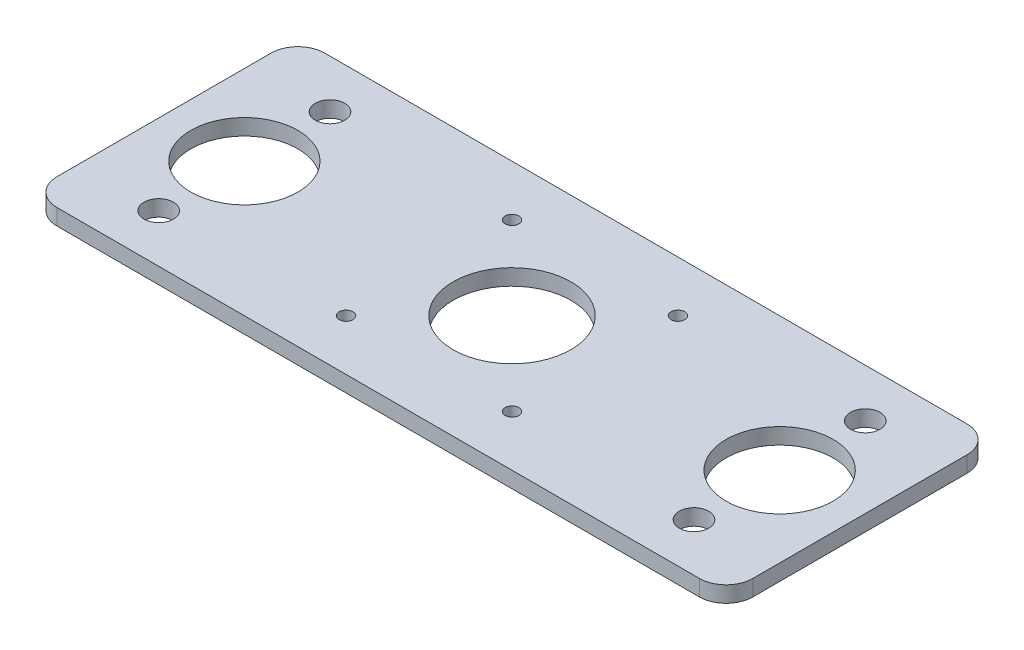
ISO-10303-21;
HEADER;
FILE_DESCRIPTION(('STEP AP214'),'2;1');
FILE_NAME('part.step','',(''),(''),'','','');
FILE_SCHEMA(('AUTOMOTIVE_DESIGN { 1 0 10303 214 1 1 1 1 }'));
ENDSEC;
DATA;
#1=APPLICATION_CONTEXT('core data for automotive mechanical design processes');
#2=APPLICATION_PROTOCOL_DEFINITION('international standard','automotive_design',2000,#1);
#3=PRODUCT_CONTEXT('',#1,'mechanical');
#4=PRODUCT('Part','Part','',(#3));
#5=PRODUCT_RELATED_PRODUCT_CATEGORY('part','',(#4));
#6=PRODUCT_DEFINITION_FORMATION('','',#4);
#7=PRODUCT_DEFINITION_CONTEXT('part definition',#1,'design');
#8=PRODUCT_DEFINITION('design','',#6,#7);
#9=PRODUCT_DEFINITION_SHAPE('','',#8);
#10=(LENGTH_UNIT() NAMED_UNIT(*) SI_UNIT(.MILLI.,.METRE.));
#11=(NAMED_UNIT(*) PLANE_ANGLE_UNIT() SI_UNIT($,.RADIAN.));
#12=(NAMED_UNIT(*) SI_UNIT($,.STERADIAN.) SOLID_ANGLE_UNIT());
#13=UNCERTAINTY_MEASURE_WITH_UNIT(LENGTH_MEASURE(1.E-05),#10,'distance_accuracy_value','');
#14=(GEOMETRIC_REPRESENTATION_CONTEXT(3) GLOBAL_UNCERTAINTY_ASSIGNED_CONTEXT((#13)) GLOBAL_UNIT_ASSIGNED_CONTEXT((#10,
#11,#12)) REPRESENTATION_CONTEXT('',''));
#15=CARTESIAN_POINT('',(0.,0.,0.));
#16=DIRECTION('',(0.,0.,1.));
#17=DIRECTION('',(1.,0.,0.));
#18=AXIS2_PLACEMENT_3D('',#15,#16,#17);
#19=CARTESIAN_POINT('',(-60.,3.,-20.));
#20=DIRECTION('',(0.,-1.,0.));
#21=DIRECTION('',(0.,0.,-1.));
#22=AXIS2_PLACEMENT_3D('',#19,#20,#21);
#23=CYLINDRICAL_SURFACE('',#22,5.);
#24=CARTESIAN_POINT('',(-60.,0.,-20.));
#25=DIRECTION('',(0.,1.,0.));
#26=DIRECTION('',(0.,0.,1.));
#27=AXIS2_PLACEMENT_3D('',#24,#25,#26);
#28=CIRCLE('',#27,5.);
#29=CARTESIAN_POINT('',(-65.,0.,-20.));
#30=VERTEX_POINT('',#29);
#31=CARTESIAN_POINT('',(-60.,0.,-25.));
#32=VERTEX_POINT('',#31);
#33=EDGE_CURVE('E169',#30,#32,#28,.F.);
#34=ORIENTED_EDGE('',*,*,#33,.F.);
#35=DIRECTION('',(0.,-1.,0.));
#36=VECTOR('',#35,1.);
#37=CARTESIAN_POINT('',(-65.,3.,-20.));
#38=LINE('',#37,#36);
#39=CARTESIAN_POINT('',(-65.,3.,-20.));
#40=VERTEX_POINT('',#39);
#41=EDGE_CURVE('E11',#40,#30,#38,.T.);
#42=ORIENTED_EDGE('',*,*,#41,.F.);
#43=CARTESIAN_POINT('',(-60.,3.,-20.));
#44=DIRECTION('',(0.,1.,0.));
#45=DIRECTION('',(0.,0.,1.));
#46=AXIS2_PLACEMENT_3D('',#43,#44,#45);
#47=CIRCLE('',#46,5.);
#48=CARTESIAN_POINT('',(-60.,3.,-25.));
#49=VERTEX_POINT('',#48);
#50=EDGE_CURVE('E222',#40,#49,#47,.F.);
#51=ORIENTED_EDGE('',*,*,#50,.T.);
#52=DIRECTION('',(0.,-1.,0.));
#53=VECTOR('',#52,1.);
#54=CARTESIAN_POINT('',(-60.,3.,-25.));
#55=LINE('',#54,#53);
#56=EDGE_CURVE('E56',#49,#32,#55,.T.);
#57=ORIENTED_EDGE('',*,*,#56,.T.);
#58=EDGE_LOOP('',(#34,#42,#51,#57));
#59=FACE_BOUND('',#58,.T.);
#60=ADVANCED_FACE('F40',(#59),#23,.T.);
#61=CARTESIAN_POINT('',(-65.,3.,0.));
#62=DIRECTION('',(-1.,0.,0.));
#63=DIRECTION('',(0.,0.,1.));
#64=AXIS2_PLACEMENT_3D('',#61,#62,#63);
#65=PLANE('',#64);
#66=DIRECTION('',(0.,0.,-1.));
#67=VECTOR('',#66,1.);
#68=CARTESIAN_POINT('',(-65.,0.,0.));
#69=LINE('',#68,#67);
#70=CARTESIAN_POINT('',(-65.,0.,20.));
#71=VERTEX_POINT('',#70);
#72=EDGE_CURVE('E171',#71,#30,#69,.T.);
#73=ORIENTED_EDGE('',*,*,#72,.F.);
#74=DIRECTION('',(0.,-1.,0.));
#75=VECTOR('',#74,1.);
#76=CARTESIAN_POINT('',(-65.,3.,20.));
#77=LINE('',#76,#75);
#78=CARTESIAN_POINT('',(-65.,3.,20.));
#79=VERTEX_POINT('',#78);
#80=EDGE_CURVE('E48',#79,#71,#77,.T.);
#81=ORIENTED_EDGE('',*,*,#80,.F.);
#82=DIRECTION('',(0.,0.,-1.));
#83=VECTOR('',#82,1.);
#84=CARTESIAN_POINT('',(-65.,3.,0.));
#85=LINE('',#84,#83);
#86=EDGE_CURVE('E248',#79,#40,#85,.T.);
#87=ORIENTED_EDGE('',*,*,#86,.T.);
#88=ORIENTED_EDGE('',*,*,#41,.T.);
#89=EDGE_LOOP('',(#73,#81,#87,#88));
#90=FACE_BOUND('',#89,.T.);
#91=ADVANCED_FACE('F239',(#90),#65,.T.);
#92=CARTESIAN_POINT('',(-60.,3.,20.));
#93=DIRECTION('',(0.,-1.,0.));
#94=DIRECTION('',(0.,0.,-1.));
#95=AXIS2_PLACEMENT_3D('',#92,#93,#94);
#96=CYLINDRICAL_SURFACE('',#95,5.);
#97=CARTESIAN_POINT('',(-60.,0.,20.));
#98=DIRECTION('',(0.,1.,0.));
#99=DIRECTION('',(0.,0.,1.));
#100=AXIS2_PLACEMENT_3D('',#97,#98,#99);
#101=CIRCLE('',#100,5.);
#102=CARTESIAN_POINT('',(-60.,0.,25.));
#103=VERTEX_POINT('',#102);
#104=EDGE_CURVE('E174',#103,#71,#101,.F.);
#105=ORIENTED_EDGE('',*,*,#104,.F.);
#106=DIRECTION('',(0.,-1.,0.));
#107=VECTOR('',#106,1.);
#108=CARTESIAN_POINT('',(-60.,3.,25.));
#109=LINE('',#108,#107);
#110=CARTESIAN_POINT('',(-60.,3.,25.));
#111=VERTEX_POINT('',#110);
#112=EDGE_CURVE('E228',#111,#103,#109,.T.);
#113=ORIENTED_EDGE('',*,*,#112,.F.);
#114=CARTESIAN_POINT('',(-60.,3.,20.));
#115=DIRECTION('',(0.,1.,0.));
#116=DIRECTION('',(0.,0.,1.));
#117=AXIS2_PLACEMENT_3D('',#114,#115,#116);
#118=CIRCLE('',#117,5.);
#119=EDGE_CURVE('E235',#111,#79,#118,.F.);
#120=ORIENTED_EDGE('',*,*,#119,.T.);
#121=ORIENTED_EDGE('',*,*,#80,.T.);
#122=EDGE_LOOP('',(#105,#113,#120,#121));
#123=FACE_BOUND('',#122,.T.);
#124=ADVANCED_FACE('F233',(#123),#96,.T.);
#125=CARTESIAN_POINT('',(0.,3.,25.));
#126=DIRECTION('',(0.,0.,1.));
#127=DIRECTION('',(1.,0.,0.));
#128=AXIS2_PLACEMENT_3D('',#125,#126,#127);
#129=PLANE('',#128);
#130=DIRECTION('',(-1.,0.,0.));
#131=VECTOR('',#130,1.);
#132=CARTESIAN_POINT('',(0.,0.,25.));
#133=LINE('',#132,#131);
#134=CARTESIAN_POINT('',(60.,0.,25.));
#135=VERTEX_POINT('',#134);
#136=EDGE_CURVE('E177',#135,#103,#133,.T.);
#137=ORIENTED_EDGE('',*,*,#136,.F.);
#138=DIRECTION('',(0.,-1.,0.));
#139=VECTOR('',#138,1.);
#140=CARTESIAN_POINT('',(60.,3.,25.));
#141=LINE('',#140,#139);
#142=CARTESIAN_POINT('',(60.,3.,25.));
#143=VERTEX_POINT('',#142);
#144=EDGE_CURVE('E226',#143,#135,#141,.T.);
#145=ORIENTED_EDGE('',*,*,#144,.F.);
#146=DIRECTION('',(-1.,0.,0.));
#147=VECTOR('',#146,1.);
#148=CARTESIAN_POINT('',(0.,3.,25.));
#149=LINE('',#148,#147);
#150=EDGE_CURVE('E131',#143,#111,#149,.T.);
#151=ORIENTED_EDGE('',*,*,#150,.T.);
#152=ORIENTED_EDGE('',*,*,#112,.T.);
#153=EDGE_LOOP('',(#137,#145,#151,#152));
#154=FACE_BOUND('',#153,.T.);
#155=ADVANCED_FACE('F246',(#154),#129,.T.);
#156=CARTESIAN_POINT('',(60.,3.,20.));
#157=DIRECTION('',(0.,-1.,0.));
#158=DIRECTION('',(0.,0.,-1.));
#159=AXIS2_PLACEMENT_3D('',#156,#157,#158);
#160=CYLINDRICAL_SURFACE('',#159,5.);
#161=CARTESIAN_POINT('',(60.,0.,20.));
#162=DIRECTION('',(0.,1.,0.));
#163=DIRECTION('',(0.,0.,1.));
#164=AXIS2_PLACEMENT_3D('',#161,#162,#163);
#165=CIRCLE('',#164,5.);
#166=CARTESIAN_POINT('',(65.,0.,20.));
#167=VERTEX_POINT('',#166);
#168=EDGE_CURVE('E180',#135,#167,#165,.T.);
#169=ORIENTED_EDGE('',*,*,#168,.T.);
#170=DIRECTION('',(0.,-1.,0.));
#171=VECTOR('',#170,1.);
#172=CARTESIAN_POINT('',(65.,3.,20.));
#173=LINE('',#172,#171);
#174=CARTESIAN_POINT('',(65.,3.,20.));
#175=VERTEX_POINT('',#174);
#176=EDGE_CURVE('E116',#175,#167,#173,.T.);
#177=ORIENTED_EDGE('',*,*,#176,.F.);
#178=CARTESIAN_POINT('',(60.,3.,20.));
#179=DIRECTION('',(0.,1.,0.));
#180=DIRECTION('',(0.,0.,1.));
#181=AXIS2_PLACEMENT_3D('',#178,#179,#180);
#182=CIRCLE('',#181,5.);
#183=EDGE_CURVE('E128',#143,#175,#182,.T.);
#184=ORIENTED_EDGE('',*,*,#183,.F.);
#185=ORIENTED_EDGE('',*,*,#144,.T.);
#186=EDGE_LOOP('',(#169,#177,#184,#185));
#187=FACE_BOUND('',#186,.T.);
#188=ADVANCED_FACE('F278',(#187),#160,.T.);
#189=CARTESIAN_POINT('',(65.,3.,0.));
#190=DIRECTION('',(1.,0.,0.));
#191=DIRECTION('',(0.,0.,-1.));
#192=AXIS2_PLACEMENT_3D('',#189,#190,#191);
#193=PLANE('',#192);
#194=DIRECTION('',(0.,0.,1.));
#195=VECTOR('',#194,1.);
#196=CARTESIAN_POINT('',(65.,0.,0.));
#197=LINE('',#196,#195);
#198=CARTESIAN_POINT('',(65.,0.,-20.));
#199=VERTEX_POINT('',#198);
#200=EDGE_CURVE('E113',#199,#167,#197,.T.);
#201=ORIENTED_EDGE('',*,*,#200,.F.);
#202=DIRECTION('',(0.,-1.,0.));
#203=VECTOR('',#202,1.);
#204=CARTESIAN_POINT('',(65.,3.,-20.));
#205=LINE('',#204,#203);
#206=CARTESIAN_POINT('',(65.,3.,-20.));
#207=VERTEX_POINT('',#206);
#208=EDGE_CURVE('E107',#207,#199,#205,.T.);
#209=ORIENTED_EDGE('',*,*,#208,.F.);
#210=DIRECTION('',(0.,0.,1.));
#211=VECTOR('',#210,1.);
#212=CARTESIAN_POINT('',(65.,3.,0.));
#213=LINE('',#212,#211);
#214=EDGE_CURVE('E111',#207,#175,#213,.T.);
#215=ORIENTED_EDGE('',*,*,#214,.T.);
#216=ORIENTED_EDGE('',*,*,#176,.T.);
#217=EDGE_LOOP('',(#201,#209,#215,#216));
#218=FACE_BOUND('',#217,.T.);
#219=ADVANCED_FACE('F109',(#218),#193,.T.);
#220=CARTESIAN_POINT('',(60.,3.,-20.));
#221=DIRECTION('',(0.,-1.,0.));
#222=DIRECTION('',(0.,0.,-1.));
#223=AXIS2_PLACEMENT_3D('',#220,#221,#222);
#224=CYLINDRICAL_SURFACE('',#223,5.);
#225=CARTESIAN_POINT('',(60.,0.,-20.));
#226=DIRECTION('',(0.,1.,0.));
#227=DIRECTION('',(0.,0.,1.));
#228=AXIS2_PLACEMENT_3D('',#225,#226,#227);
#229=CIRCLE('',#228,5.);
#230=CARTESIAN_POINT('',(60.,0.,-25.));
#231=VERTEX_POINT('',#230);
#232=EDGE_CURVE('E184',#199,#231,#229,.T.);
#233=ORIENTED_EDGE('',*,*,#232,.T.);
#234=DIRECTION('',(0.,-1.,0.));
#235=VECTOR('',#234,1.);
#236=CARTESIAN_POINT('',(60.,3.,-25.));
#237=LINE('',#236,#235);
#238=CARTESIAN_POINT('',(60.,3.,-25.));
#239=VERTEX_POINT('',#238);
#240=EDGE_CURVE('E82',#239,#231,#237,.T.);
#241=ORIENTED_EDGE('',*,*,#240,.F.);
#242=CARTESIAN_POINT('',(60.,3.,-20.));
#243=DIRECTION('',(0.,1.,0.));
#244=DIRECTION('',(0.,0.,1.));
#245=AXIS2_PLACEMENT_3D('',#242,#243,#244);
#246=CIRCLE('',#245,5.);
#247=EDGE_CURVE('E118',#207,#239,#246,.T.);
#248=ORIENTED_EDGE('',*,*,#247,.F.);
#249=ORIENTED_EDGE('',*,*,#208,.T.);
#250=EDGE_LOOP('',(#233,#241,#248,#249));
#251=FACE_BOUND('',#250,.T.);
#252=ADVANCED_FACE('F119',(#251),#224,.T.);
#253=CARTESIAN_POINT('',(-50.,3.,16.));
#254=DIRECTION('',(0.,-1.,0.));
#255=DIRECTION('',(0.,0.,-1.));
#256=AXIS2_PLACEMENT_3D('',#253,#254,#255);
#257=CYLINDRICAL_SURFACE('',#256,2.74999999999999);
#258=CARTESIAN_POINT('',(-50.,3.,16.));
#259=DIRECTION('',(0.,1.,0.));
#260=DIRECTION('',(0.,0.,1.));
#261=AXIS2_PLACEMENT_3D('',#258,#259,#260);
#262=CIRCLE('',#261,2.74999999999999);
#263=CARTESIAN_POINT('',(-50.,3.,18.75));
#264=VERTEX_POINT('',#263);
#265=EDGE_CURVE('E163',#264,#264,#262,.F.);
#266=ORIENTED_EDGE('',*,*,#265,.F.);
#267=EDGE_LOOP('',(#266));
#268=FACE_BOUND('',#267,.T.);
#269=CARTESIAN_POINT('',(-50.,0.,16.));
#270=DIRECTION('',(0.,1.,0.));
#271=DIRECTION('',(0.,0.,1.));
#272=AXIS2_PLACEMENT_3D('',#269,#270,#271);
#273=CIRCLE('',#272,2.74999999999999);
#274=CARTESIAN_POINT('',(-50.,0.,18.75));
#275=VERTEX_POINT('',#274);
#276=EDGE_CURVE('E216',#275,#275,#273,.F.);
#277=ORIENTED_EDGE('',*,*,#276,.T.);
#278=EDGE_LOOP('',(#277));
#279=FACE_BOUND('',#278,.T.);
#280=ADVANCED_FACE('F284',(#268,#279),#257,.F.);
#281=CARTESIAN_POINT('',(50.,3.,16.));
#282=DIRECTION('',(0.,-1.,0.));
#283=DIRECTION('',(0.,0.,-1.));
#284=AXIS2_PLACEMENT_3D('',#281,#282,#283);
#285=CYLINDRICAL_SURFACE('',#284,2.74999999999999);
#286=CARTESIAN_POINT('',(50.,3.,16.));
#287=DIRECTION('',(0.,1.,0.));
#288=DIRECTION('',(0.,0.,1.));
#289=AXIS2_PLACEMENT_3D('',#286,#287,#288);
#290=CIRCLE('',#289,2.74999999999999);
#291=CARTESIAN_POINT('',(50.,3.,18.75));
#292=VERTEX_POINT('',#291);
#293=EDGE_CURVE('E160',#292,#292,#290,.T.);
#294=ORIENTED_EDGE('',*,*,#293,.T.);
#295=EDGE_LOOP('',(#294));
#296=FACE_BOUND('',#295,.T.);
#297=CARTESIAN_POINT('',(50.,0.,16.));
#298=DIRECTION('',(0.,1.,0.));
#299=DIRECTION('',(0.,0.,1.));
#300=AXIS2_PLACEMENT_3D('',#297,#298,#299);
#301=CIRCLE('',#300,2.74999999999999);
#302=CARTESIAN_POINT('',(50.,0.,18.75));
#303=VERTEX_POINT('',#302);
#304=EDGE_CURVE('E213',#303,#303,#301,.T.);
#305=ORIENTED_EDGE('',*,*,#304,.F.);
#306=EDGE_LOOP('',(#305));
#307=FACE_BOUND('',#306,.T.);
#308=ADVANCED_FACE('F288',(#296,#307),#285,.F.);
#309=CARTESIAN_POINT('',(50.,3.,-16.));
#310=DIRECTION('',(0.,-1.,0.));
#311=DIRECTION('',(0.,0.,-1.));
#312=AXIS2_PLACEMENT_3D('',#309,#310,#311);
#313=CYLINDRICAL_SURFACE('',#312,2.75);
#314=CARTESIAN_POINT('',(50.,3.,-16.));
#315=DIRECTION('',(0.,1.,0.));
#316=DIRECTION('',(0.,0.,1.));
#317=AXIS2_PLACEMENT_3D('',#314,#315,#316);
#318=CIRCLE('',#317,2.75);
#319=CARTESIAN_POINT('',(50.,3.,-13.25));
#320=VERTEX_POINT('',#319);
#321=EDGE_CURVE('E157',#320,#320,#318,.T.);
#322=ORIENTED_EDGE('',*,*,#321,.T.);
#323=EDGE_LOOP('',(#322));
#324=FACE_BOUND('',#323,.T.);
#325=CARTESIAN_POINT('',(50.,0.,-16.));
#326=DIRECTION('',(0.,1.,0.));
#327=DIRECTION('',(0.,0.,1.));
#328=AXIS2_PLACEMENT_3D('',#325,#326,#327);
#329=CIRCLE('',#328,2.75);
#330=CARTESIAN_POINT('',(50.,0.,-13.25));
#331=VERTEX_POINT('',#330);
#332=EDGE_CURVE('E210',#331,#331,#329,.T.);
#333=ORIENTED_EDGE('',*,*,#332,.F.);
#334=EDGE_LOOP('',(#333));
#335=FACE_BOUND('',#334,.T.);
#336=ADVANCED_FACE('F294',(#324,#335),#313,.F.);
#337=CARTESIAN_POINT('',(50.,3.,0.));
#338=DIRECTION('',(0.,-1.,0.));
#339=DIRECTION('',(0.,0.,-1.));
#340=AXIS2_PLACEMENT_3D('',#337,#338,#339);
#341=CYLINDRICAL_SURFACE('',#340,10.);
#342=CARTESIAN_POINT('',(50.,3.,0.));
#343=DIRECTION('',(0.,1.,0.));
#344=DIRECTION('',(0.,0.,1.));
#345=AXIS2_PLACEMENT_3D('',#342,#343,#344);
#346=CIRCLE('',#345,10.);
#347=CARTESIAN_POINT('',(50.,3.,10.));
#348=VERTEX_POINT('',#347);
#349=EDGE_CURVE('E154',#348,#348,#346,.T.);
#350=ORIENTED_EDGE('',*,*,#349,.T.);
#351=EDGE_LOOP('',(#350));
#352=FACE_BOUND('',#351,.T.);
#353=CARTESIAN_POINT('',(50.,0.,0.));
#354=DIRECTION('',(0.,1.,0.));
#355=DIRECTION('',(0.,0.,1.));
#356=AXIS2_PLACEMENT_3D('',#353,#354,#355);
#357=CIRCLE('',#356,10.);
#358=CARTESIAN_POINT('',(50.,0.,10.));
#359=VERTEX_POINT('',#358);
#360=EDGE_CURVE('E207',#359,#359,#357,.T.);
#361=ORIENTED_EDGE('',*,*,#360,.F.);
#362=EDGE_LOOP('',(#361));
#363=FACE_BOUND('',#362,.T.);
#364=ADVANCED_FACE('F303',(#352,#363),#341,.F.);
#365=CARTESIAN_POINT('',(-15.4999999999996,3.,-15.4999999999983));
#366=DIRECTION('',(0.,-1.,0.));
#367=DIRECTION('',(0.,0.,-1.));
#368=AXIS2_PLACEMENT_3D('',#365,#366,#367);
#369=CYLINDRICAL_SURFACE('',#368,1.28355817354355);
#370=CARTESIAN_POINT('',(-15.4999999999996,3.,-15.4999999999983));
#371=DIRECTION('',(0.,1.,0.));
#372=DIRECTION('',(0.,0.,1.));
#373=AXIS2_PLACEMENT_3D('',#370,#371,#372);
#374=CIRCLE('',#373,1.28355817354355);
#375=CARTESIAN_POINT('',(-15.4999999999996,3.,-14.2164418264547));
#376=VERTEX_POINT('',#375);
#377=EDGE_CURVE('E151',#376,#376,#374,.T.);
#378=ORIENTED_EDGE('',*,*,#377,.T.);
#379=EDGE_LOOP('',(#378));
#380=FACE_BOUND('',#379,.T.);
#381=CARTESIAN_POINT('',(-15.4999999999996,0.,-15.4999999999983));
#382=DIRECTION('',(0.,1.,0.));
#383=DIRECTION('',(0.,0.,1.));
#384=AXIS2_PLACEMENT_3D('',#381,#382,#383);
#385=CIRCLE('',#384,1.28355817354355);
#386=CARTESIAN_POINT('',(-15.4999999999996,0.,-14.2164418264547));
#387=VERTEX_POINT('',#386);
#388=EDGE_CURVE('E204',#387,#387,#385,.T.);
#389=ORIENTED_EDGE('',*,*,#388,.F.);
#390=EDGE_LOOP('',(#389));
#391=FACE_BOUND('',#390,.T.);
#392=ADVANCED_FACE('F307',(#380,#391),#369,.F.);
#393=CARTESIAN_POINT('',(-15.4999999999978,3.,15.5000000000013));
#394=DIRECTION('',(0.,-1.,0.));
#395=DIRECTION('',(0.,0.,-1.));
#396=AXIS2_PLACEMENT_3D('',#393,#394,#395);
#397=CYLINDRICAL_SURFACE('',#396,1.28355817354343);
#398=CARTESIAN_POINT('',(-15.4999999999978,3.,15.5000000000013));
#399=DIRECTION('',(0.,1.,0.));
#400=DIRECTION('',(0.,0.,1.));
#401=AXIS2_PLACEMENT_3D('',#398,#399,#400);
#402=CIRCLE('',#401,1.28355817354343);
#403=CARTESIAN_POINT('',(-15.4999999999978,3.,16.7835581735447));
#404=VERTEX_POINT('',#403);
#405=EDGE_CURVE('E148',#404,#404,#402,.T.);
#406=ORIENTED_EDGE('',*,*,#405,.T.);
#407=EDGE_LOOP('',(#406));
#408=FACE_BOUND('',#407,.T.);
#409=CARTESIAN_POINT('',(-15.4999999999978,0.,15.5000000000013));
#410=DIRECTION('',(0.,1.,0.));
#411=DIRECTION('',(0.,0.,1.));
#412=AXIS2_PLACEMENT_3D('',#409,#410,#411);
#413=CIRCLE('',#412,1.28355817354343);
#414=CARTESIAN_POINT('',(-15.4999999999978,0.,16.7835581735447));
#415=VERTEX_POINT('',#414);
#416=EDGE_CURVE('E201',#415,#415,#413,.T.);
#417=ORIENTED_EDGE('',*,*,#416,.F.);
#418=EDGE_LOOP('',(#417));
#419=FACE_BOUND('',#418,.T.);
#420=ADVANCED_FACE('F311',(#408,#419),#397,.F.);
#421=CARTESIAN_POINT('',(15.5000000000017,3.,15.4999999999996));
#422=DIRECTION('',(0.,-1.,0.));
#423=DIRECTION('',(0.,0.,-1.));
#424=AXIS2_PLACEMENT_3D('',#421,#422,#423);
#425=CYLINDRICAL_SURFACE('',#424,1.28355817354161);
#426=CARTESIAN_POINT('',(15.5000000000017,3.,15.4999999999996));
#427=DIRECTION('',(0.,1.,0.));
#428=DIRECTION('',(0.,0.,1.));
#429=AXIS2_PLACEMENT_3D('',#426,#427,#428);
#430=CIRCLE('',#429,1.28355817354161);
#431=CARTESIAN_POINT('',(15.5000000000017,3.,16.7835581735412));
#432=VERTEX_POINT('',#431);
#433=EDGE_CURVE('E145',#432,#432,#430,.T.);
#434=ORIENTED_EDGE('',*,*,#433,.T.);
#435=EDGE_LOOP('',(#434));
#436=FACE_BOUND('',#435,.T.);
#437=CARTESIAN_POINT('',(15.5000000000017,0.,15.4999999999996));
#438=DIRECTION('',(0.,1.,0.));
#439=DIRECTION('',(0.,0.,1.));
#440=AXIS2_PLACEMENT_3D('',#437,#438,#439);
#441=CIRCLE('',#440,1.28355817354161);
#442=CARTESIAN_POINT('',(15.5000000000017,0.,16.7835581735412));
#443=VERTEX_POINT('',#442);
#444=EDGE_CURVE('E198',#443,#443,#441,.T.);
#445=ORIENTED_EDGE('',*,*,#444,.F.);
#446=EDGE_LOOP('',(#445));
#447=FACE_BOUND('',#446,.T.);
#448=ADVANCED_FACE('F315',(#436,#447),#425,.F.);
#449=CARTESIAN_POINT('',(15.5,3.,-15.5));
#450=DIRECTION('',(0.,-1.,0.));
#451=DIRECTION('',(0.,0.,-1.));
#452=AXIS2_PLACEMENT_3D('',#449,#450,#451);
#453=CYLINDRICAL_SURFACE('',#452,1.28355817354166);
#454=CARTESIAN_POINT('',(15.5,3.,-15.5));
#455=DIRECTION('',(0.,1.,0.));
#456=DIRECTION('',(0.,0.,1.));
#457=AXIS2_PLACEMENT_3D('',#454,#455,#456);
#458=CIRCLE('',#457,1.28355817354166);
#459=CARTESIAN_POINT('',(15.5,3.,-14.2164418264583));
#460=VERTEX_POINT('',#459);
#461=EDGE_CURVE('E142',#460,#460,#458,.T.);
#462=ORIENTED_EDGE('',*,*,#461,.T.);
#463=EDGE_LOOP('',(#462));
#464=FACE_BOUND('',#463,.T.);
#465=CARTESIAN_POINT('',(15.5,0.,-15.5));
#466=DIRECTION('',(0.,1.,0.));
#467=DIRECTION('',(0.,0.,1.));
#468=AXIS2_PLACEMENT_3D('',#465,#466,#467);
#469=CIRCLE('',#468,1.28355817354166);
#470=CARTESIAN_POINT('',(15.5,0.,-14.2164418264583));
#471=VERTEX_POINT('',#470);
#472=EDGE_CURVE('E195',#471,#471,#469,.T.);
#473=ORIENTED_EDGE('',*,*,#472,.F.);
#474=EDGE_LOOP('',(#473));
#475=FACE_BOUND('',#474,.T.);
#476=ADVANCED_FACE('F319',(#464,#475),#453,.F.);
#477=CARTESIAN_POINT('',(0.,3.,0.));
#478=DIRECTION('',(0.,-1.,0.));
#479=DIRECTION('',(0.,0.,-1.));
#480=AXIS2_PLACEMENT_3D('',#477,#478,#479);
#481=CYLINDRICAL_SURFACE('',#480,11.);
#482=CARTESIAN_POINT('',(0.,3.,0.));
#483=DIRECTION('',(0.,1.,0.));
#484=DIRECTION('',(0.,0.,1.));
#485=AXIS2_PLACEMENT_3D('',#482,#483,#484);
#486=CIRCLE('',#485,11.);
#487=CARTESIAN_POINT('',(0.,3.,11.));
#488=VERTEX_POINT('',#487);
#489=EDGE_CURVE('E139',#488,#488,#486,.T.);
#490=ORIENTED_EDGE('',*,*,#489,.T.);
#491=EDGE_LOOP('',(#490));
#492=FACE_BOUND('',#491,.T.);
#493=CARTESIAN_POINT('',(0.,0.,0.));
#494=DIRECTION('',(0.,1.,0.));
#495=DIRECTION('',(0.,0.,1.));
#496=AXIS2_PLACEMENT_3D('',#493,#494,#495);
#497=CIRCLE('',#496,11.);
#498=CARTESIAN_POINT('',(0.,0.,11.));
#499=VERTEX_POINT('',#498);
#500=EDGE_CURVE('E192',#499,#499,#497,.T.);
#501=ORIENTED_EDGE('',*,*,#500,.F.);
#502=EDGE_LOOP('',(#501));
#503=FACE_BOUND('',#502,.T.);
#504=ADVANCED_FACE('F263',(#492,#503),#481,.F.);
#505=CARTESIAN_POINT('',(-50.,3.,-16.));
#506=DIRECTION('',(0.,-1.,0.));
#507=DIRECTION('',(0.,0.,-1.));
#508=AXIS2_PLACEMENT_3D('',#505,#506,#507);
#509=CYLINDRICAL_SURFACE('',#508,2.75);
#510=CARTESIAN_POINT('',(-50.,3.,-16.));
#511=DIRECTION('',(0.,1.,0.));
#512=DIRECTION('',(0.,0.,1.));
#513=AXIS2_PLACEMENT_3D('',#510,#511,#512);
#514=CIRCLE('',#513,2.75);
#515=CARTESIAN_POINT('',(-50.,3.,-13.25));
#516=VERTEX_POINT('',#515);
#517=EDGE_CURVE('E136',#516,#516,#514,.F.);
#518=ORIENTED_EDGE('',*,*,#517,.F.);
#519=EDGE_LOOP('',(#518));
#520=FACE_BOUND('',#519,.T.);
#521=CARTESIAN_POINT('',(-50.,0.,-16.));
#522=DIRECTION('',(0.,1.,0.));
#523=DIRECTION('',(0.,0.,1.));
#524=AXIS2_PLACEMENT_3D('',#521,#522,#523);
#525=CIRCLE('',#524,2.75);
#526=CARTESIAN_POINT('',(-50.,0.,-13.25));
#527=VERTEX_POINT('',#526);
#528=EDGE_CURVE('E189',#527,#527,#525,.F.);
#529=ORIENTED_EDGE('',*,*,#528,.T.);
#530=EDGE_LOOP('',(#529));
#531=FACE_BOUND('',#530,.T.);
#532=ADVANCED_FACE('F255',(#520,#531),#509,.F.);
#533=CARTESIAN_POINT('',(0.,3.,-25.));
#534=DIRECTION('',(0.,0.,-1.));
#535=DIRECTION('',(-1.,0.,0.));
#536=AXIS2_PLACEMENT_3D('',#533,#534,#535);
#537=PLANE('',#536);
#538=DIRECTION('',(1.,0.,0.));
#539=VECTOR('',#538,1.);
#540=CARTESIAN_POINT('',(0.,0.,-25.));
#541=LINE('',#540,#539);
#542=EDGE_CURVE('E186',#32,#231,#541,.T.);
#543=ORIENTED_EDGE('',*,*,#542,.F.);
#544=ORIENTED_EDGE('',*,*,#56,.F.);
#545=DIRECTION('',(1.,0.,0.));
#546=VECTOR('',#545,1.);
#547=CARTESIAN_POINT('',(0.,3.,-25.));
#548=LINE('',#547,#546);
#549=EDGE_CURVE('E122',#49,#239,#548,.T.);
#550=ORIENTED_EDGE('',*,*,#549,.T.);
#551=ORIENTED_EDGE('',*,*,#240,.T.);
#552=EDGE_LOOP('',(#543,#544,#550,#551));
#553=FACE_BOUND('',#552,.T.);
#554=ADVANCED_FACE('F252',(#553),#537,.T.);
#555=CARTESIAN_POINT('',(-50.,3.,0.));
#556=DIRECTION('',(0.,-1.,0.));
#557=DIRECTION('',(0.,0.,-1.));
#558=AXIS2_PLACEMENT_3D('',#555,#556,#557);
#559=CYLINDRICAL_SURFACE('',#558,10.);
#560=CARTESIAN_POINT('',(-50.,3.,0.));
#561=DIRECTION('',(0.,1.,0.));
#562=DIRECTION('',(0.,0.,1.));
#563=AXIS2_PLACEMENT_3D('',#560,#561,#562);
#564=CIRCLE('',#563,10.);
#565=CARTESIAN_POINT('',(-50.,3.,10.));
#566=VERTEX_POINT('',#565);
#567=EDGE_CURVE('E166',#566,#566,#564,.F.);
#568=ORIENTED_EDGE('',*,*,#567,.F.);
#569=EDGE_LOOP('',(#568));
#570=FACE_BOUND('',#569,.T.);
#571=CARTESIAN_POINT('',(-50.,0.,0.));
#572=DIRECTION('',(0.,1.,0.));
#573=DIRECTION('',(0.,0.,1.));
#574=AXIS2_PLACEMENT_3D('',#571,#572,#573);
#575=CIRCLE('',#574,10.);
#576=CARTESIAN_POINT('',(-50.,0.,10.));
#577=VERTEX_POINT('',#576);
#578=EDGE_CURVE('E219',#577,#577,#575,.F.);
#579=ORIENTED_EDGE('',*,*,#578,.T.);
#580=EDGE_LOOP('',(#579));
#581=FACE_BOUND('',#580,.T.);
#582=ADVANCED_FACE('F254',(#570,#581),#559,.F.);
#583=CARTESIAN_POINT('',(0.,3.,0.));
#584=DIRECTION('',(0.,1.,0.));
#585=DIRECTION('',(0.,0.,1.));
#586=AXIS2_PLACEMENT_3D('',#583,#584,#585);
#587=PLANE('',#586);
#588=ORIENTED_EDGE('',*,*,#50,.F.);
#589=ORIENTED_EDGE('',*,*,#86,.F.);
#590=ORIENTED_EDGE('',*,*,#119,.F.);
#591=ORIENTED_EDGE('',*,*,#150,.F.);
#592=ORIENTED_EDGE('',*,*,#183,.T.);
#593=ORIENTED_EDGE('',*,*,#214,.F.);
#594=ORIENTED_EDGE('',*,*,#247,.T.);
#595=ORIENTED_EDGE('',*,*,#549,.F.);
#596=EDGE_LOOP('',(#588,#589,#590,#591,#592,#593,#594,#595));
#597=FACE_BOUND('',#596,.T.);
#598=ORIENTED_EDGE('',*,*,#517,.T.);
#599=EDGE_LOOP('',(#598));
#600=FACE_BOUND('',#599,.T.);
#601=ORIENTED_EDGE('',*,*,#489,.F.);
#602=EDGE_LOOP('',(#601));
#603=FACE_BOUND('',#602,.T.);
#604=ORIENTED_EDGE('',*,*,#461,.F.);
#605=EDGE_LOOP('',(#604));
#606=FACE_BOUND('',#605,.T.);
#607=ORIENTED_EDGE('',*,*,#433,.F.);
#608=EDGE_LOOP('',(#607));
#609=FACE_BOUND('',#608,.T.);
#610=ORIENTED_EDGE('',*,*,#405,.F.);
#611=EDGE_LOOP('',(#610));
#612=FACE_BOUND('',#611,.T.);
#613=ORIENTED_EDGE('',*,*,#377,.F.);
#614=EDGE_LOOP('',(#613));
#615=FACE_BOUND('',#614,.T.);
#616=ORIENTED_EDGE('',*,*,#349,.F.);
#617=EDGE_LOOP('',(#616));
#618=FACE_BOUND('',#617,.T.);
#619=ORIENTED_EDGE('',*,*,#321,.F.);
#620=EDGE_LOOP('',(#619));
#621=FACE_BOUND('',#620,.T.);
#622=ORIENTED_EDGE('',*,*,#293,.F.);
#623=EDGE_LOOP('',(#622));
#624=FACE_BOUND('',#623,.T.);
#625=ORIENTED_EDGE('',*,*,#265,.T.);
#626=EDGE_LOOP('',(#625));
#627=FACE_BOUND('',#626,.T.);
#628=ORIENTED_EDGE('',*,*,#567,.T.);
#629=EDGE_LOOP('',(#628));
#630=FACE_BOUND('',#629,.T.);
#631=ADVANCED_FACE('F124',(#597,#600,#603,#606,#609,#612,#615,#618,#621,#624,#627,#630),#587,.T.);
#632=CARTESIAN_POINT('',(0.,0.,0.));
#633=DIRECTION('',(0.,1.,0.));
#634=DIRECTION('',(0.,0.,1.));
#635=AXIS2_PLACEMENT_3D('',#632,#633,#634);
#636=PLANE('',#635);
#637=ORIENTED_EDGE('',*,*,#33,.T.);
#638=ORIENTED_EDGE('',*,*,#542,.T.);
#639=ORIENTED_EDGE('',*,*,#232,.F.);
#640=ORIENTED_EDGE('',*,*,#200,.T.);
#641=ORIENTED_EDGE('',*,*,#168,.F.);
#642=ORIENTED_EDGE('',*,*,#136,.T.);
#643=ORIENTED_EDGE('',*,*,#104,.T.);
#644=ORIENTED_EDGE('',*,*,#72,.T.);
#645=EDGE_LOOP('',(#637,#638,#639,#640,#641,#642,#643,#644));
#646=FACE_BOUND('',#645,.T.);
#647=ORIENTED_EDGE('',*,*,#528,.F.);
#648=EDGE_LOOP('',(#647));
#649=FACE_BOUND('',#648,.T.);
#650=ORIENTED_EDGE('',*,*,#500,.T.);
#651=EDGE_LOOP('',(#650));
#652=FACE_BOUND('',#651,.T.);
#653=ORIENTED_EDGE('',*,*,#472,.T.);
#654=EDGE_LOOP('',(#653));
#655=FACE_BOUND('',#654,.T.);
#656=ORIENTED_EDGE('',*,*,#444,.T.);
#657=EDGE_LOOP('',(#656));
#658=FACE_BOUND('',#657,.T.);
#659=ORIENTED_EDGE('',*,*,#416,.T.);
#660=EDGE_LOOP('',(#659));
#661=FACE_BOUND('',#660,.T.);
#662=ORIENTED_EDGE('',*,*,#388,.T.);
#663=EDGE_LOOP('',(#662));
#664=FACE_BOUND('',#663,.T.);
#665=ORIENTED_EDGE('',*,*,#360,.T.);
#666=EDGE_LOOP('',(#665));
#667=FACE_BOUND('',#666,.T.);
#668=ORIENTED_EDGE('',*,*,#332,.T.);
#669=EDGE_LOOP('',(#668));
#670=FACE_BOUND('',#669,.T.);
#671=ORIENTED_EDGE('',*,*,#304,.T.);
#672=EDGE_LOOP('',(#671));
#673=FACE_BOUND('',#672,.T.);
#674=ORIENTED_EDGE('',*,*,#276,.F.);
#675=EDGE_LOOP('',(#674));
#676=FACE_BOUND('',#675,.T.);
#677=ORIENTED_EDGE('',*,*,#578,.F.);
#678=EDGE_LOOP('',(#677));
#679=FACE_BOUND('',#678,.T.);
#680=ADVANCED_FACE('F241',(#646,#649,#652,#655,#658,#661,#664,#667,#670,#673,#676,#679),#636,.F.);
#681=CLOSED_SHELL('',(#60,#91,#124,#155,#188,#219,#252,#280,#308,#336,#364,#392,#420,#448,#476,
#504,#532,#554,#582,#631,#680));
#682=MANIFOLD_SOLID_BREP('B2',#681);
#683=ADVANCED_BREP_SHAPE_REPRESENTATION('',(#18,#682),#14);
#684=SHAPE_DEFINITION_REPRESENTATION(#9,#683);
ENDSEC;
END-ISO-10303-21;
